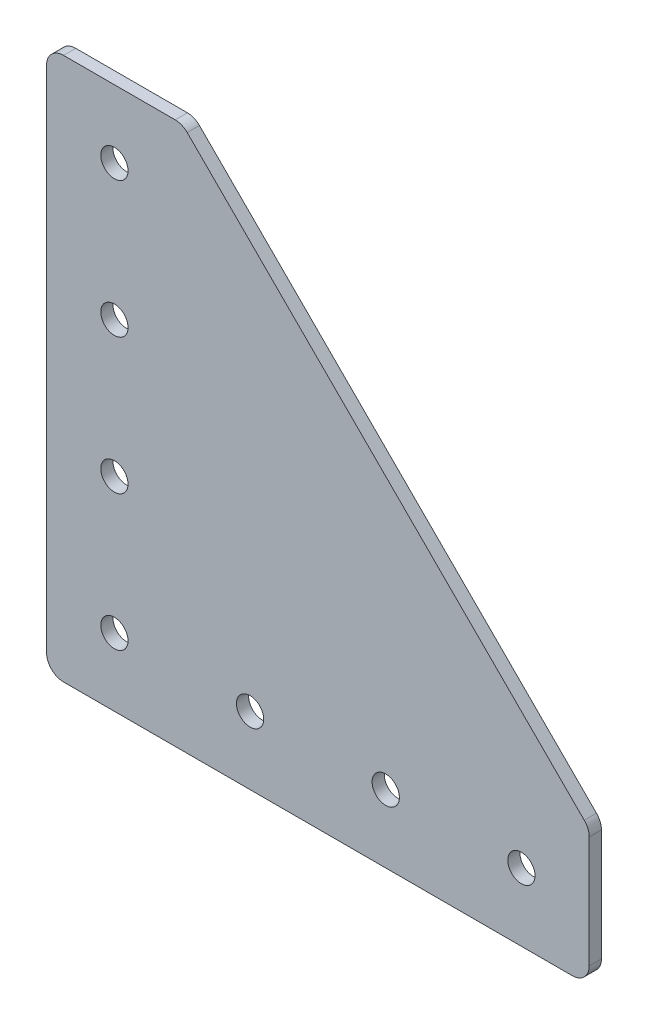
ISO-10303-21;
HEADER;
FILE_DESCRIPTION(('STEP AP214'),'2;1');
FILE_NAME('part.step','',(''),(''),'','','');
FILE_SCHEMA(('AUTOMOTIVE_DESIGN { 1 0 10303 214 1 1 1 1 }'));
ENDSEC;
DATA;
#1=APPLICATION_CONTEXT('core data for automotive mechanical design processes');
#2=APPLICATION_PROTOCOL_DEFINITION('international standard','automotive_design',2000,#1);
#3=PRODUCT_CONTEXT('',#1,'mechanical');
#4=PRODUCT('Part','Part','',(#3));
#5=PRODUCT_RELATED_PRODUCT_CATEGORY('part','',(#4));
#6=PRODUCT_DEFINITION_FORMATION('','',#4);
#7=PRODUCT_DEFINITION_CONTEXT('part definition',#1,'design');
#8=PRODUCT_DEFINITION('design','',#6,#7);
#9=PRODUCT_DEFINITION_SHAPE('','',#8);
#10=(LENGTH_UNIT() NAMED_UNIT(*) SI_UNIT(.MILLI.,.METRE.));
#11=(NAMED_UNIT(*) PLANE_ANGLE_UNIT() SI_UNIT($,.RADIAN.));
#12=(NAMED_UNIT(*) SI_UNIT($,.STERADIAN.) SOLID_ANGLE_UNIT());
#13=UNCERTAINTY_MEASURE_WITH_UNIT(LENGTH_MEASURE(1.E-05),#10,'distance_accuracy_value','');
#14=(GEOMETRIC_REPRESENTATION_CONTEXT(3) GLOBAL_UNCERTAINTY_ASSIGNED_CONTEXT((#13)) GLOBAL_UNIT_ASSIGNED_CONTEXT((#10,
#11,#12)) REPRESENTATION_CONTEXT('',''));
#15=CARTESIAN_POINT('',(0.,0.,0.));
#16=DIRECTION('',(0.,0.,1.));
#17=DIRECTION('',(1.,0.,0.));
#18=AXIS2_PLACEMENT_3D('',#15,#16,#17);
#19=CARTESIAN_POINT('',(0.,0.,1.143));
#20=DIRECTION('',(0.,0.,1.));
#21=DIRECTION('',(1.,0.,0.));
#22=AXIS2_PLACEMENT_3D('',#19,#20,#21);
#23=PLANE('',#22);
#24=CARTESIAN_POINT('',(4.94631578947392,-54.8105263157901,1.143));
#25=DIRECTION('',(0.,0.,1.));
#26=DIRECTION('',(1.,0.,0.));
#27=AXIS2_PLACEMENT_3D('',#24,#25,#26);
#28=CIRCLE('',#27,2.5527);
#29=CARTESIAN_POINT('',(7.49901578947392,-54.8105263157901,1.143));
#30=VERTEX_POINT('',#29);
#31=EDGE_CURVE('E233',#30,#30,#28,.T.);
#32=ORIENTED_EDGE('',*,*,#31,.F.);
#33=EDGE_LOOP('',(#32));
#34=FACE_BOUND('',#33,.T.);
#35=CARTESIAN_POINT('',(-45.8536842105261,-54.8105263157901,1.143));
#36=DIRECTION('',(0.,0.,1.));
#37=DIRECTION('',(1.,0.,0.));
#38=AXIS2_PLACEMENT_3D('',#35,#36,#37);
#39=CIRCLE('',#38,2.5527);
#40=CARTESIAN_POINT('',(-43.3009842105261,-54.8105263157901,1.143));
#41=VERTEX_POINT('',#40);
#42=EDGE_CURVE('E221',#41,#41,#39,.T.);
#43=ORIENTED_EDGE('',*,*,#42,.F.);
#44=EDGE_LOOP('',(#43));
#45=FACE_BOUND('',#44,.T.);
#46=CARTESIAN_POINT('',(-45.8536842105266,-4.01052631579008,1.143));
#47=DIRECTION('',(0.,0.,1.));
#48=DIRECTION('',(1.,0.,0.));
#49=AXIS2_PLACEMENT_3D('',#46,#47,#48);
#50=CIRCLE('',#49,2.5527);
#51=CARTESIAN_POINT('',(-43.3009842105266,-4.01052631579008,1.143));
#52=VERTEX_POINT('',#51);
#53=EDGE_CURVE('E210',#52,#52,#50,.T.);
#54=ORIENTED_EDGE('',*,*,#53,.F.);
#55=EDGE_LOOP('',(#54));
#56=FACE_BOUND('',#55,.T.);
#57=DIRECTION('',(-1.,0.,0.));
#58=VECTOR('',#57,1.);
#59=CARTESIAN_POINT('',(-58.5536842105269,34.0894736842099,1.143));
#60=LINE('',#59,#58);
#61=CARTESIAN_POINT('',(-34.4688122710615,34.0894736842099,1.143));
#62=VERTEX_POINT('',#61);
#63=CARTESIAN_POINT('',(-55.3786842105269,34.0894736842099,1.143));
#64=VERTEX_POINT('',#63);
#65=EDGE_CURVE('E149',#62,#64,#60,.T.);
#66=ORIENTED_EDGE('',*,*,#65,.T.);
#67=CARTESIAN_POINT('',(-55.3786842105269,30.9144736842099,1.143));
#68=DIRECTION('',(0.,0.,1.));
#69=DIRECTION('',(1.,0.,0.));
#70=AXIS2_PLACEMENT_3D('',#67,#68,#69);
#71=CIRCLE('',#70,3.175);
#72=CARTESIAN_POINT('',(-58.5536842105269,30.9144736842099,1.143));
#73=VERTEX_POINT('',#72);
#74=EDGE_CURVE('E174',#64,#73,#71,.T.);
#75=ORIENTED_EDGE('',*,*,#74,.T.);
#76=DIRECTION('',(0.,-1.,0.));
#77=VECTOR('',#76,1.);
#78=CARTESIAN_POINT('',(-58.5536842105269,34.0894736842099,1.143));
#79=LINE('',#78,#77);
#80=CARTESIAN_POINT('',(-58.5536842105269,-64.3355263157901,1.143));
#81=VERTEX_POINT('',#80);
#82=EDGE_CURVE('E131',#73,#81,#79,.T.);
#83=ORIENTED_EDGE('',*,*,#82,.T.);
#84=CARTESIAN_POINT('',(-55.3786842105269,-64.3355263157901,1.143));
#85=DIRECTION('',(0.,0.,1.));
#86=DIRECTION('',(1.,0.,0.));
#87=AXIS2_PLACEMENT_3D('',#84,#85,#86);
#88=CIRCLE('',#87,3.175);
#89=CARTESIAN_POINT('',(-55.3786842105269,-67.5105263157901,1.143));
#90=VERTEX_POINT('',#89);
#91=EDGE_CURVE('E169',#81,#90,#88,.T.);
#92=ORIENTED_EDGE('',*,*,#91,.T.);
#93=DIRECTION('',(1.,0.,0.));
#94=VECTOR('',#93,1.);
#95=CARTESIAN_POINT('',(-58.5536842105269,-67.5105263157901,1.143));
#96=LINE('',#95,#94);
#97=CARTESIAN_POINT('',(39.8713157894731,-67.5105263157901,1.143));
#98=VERTEX_POINT('',#97);
#99=EDGE_CURVE('E191',#90,#98,#96,.T.);
#100=ORIENTED_EDGE('',*,*,#99,.T.);
#101=CARTESIAN_POINT('',(39.8713157894731,-64.3355263157901,1.143));
#102=DIRECTION('',(0.,0.,1.));
#103=DIRECTION('',(1.,0.,0.));
#104=AXIS2_PLACEMENT_3D('',#101,#102,#103);
#105=CIRCLE('',#104,3.175);
#106=CARTESIAN_POINT('',(43.0463157894731,-64.3355263157901,1.143));
#107=VERTEX_POINT('',#106);
#108=EDGE_CURVE('E171',#98,#107,#105,.T.);
#109=ORIENTED_EDGE('',*,*,#108,.T.);
#110=DIRECTION('',(0.,1.,0.));
#111=VECTOR('',#110,1.);
#112=CARTESIAN_POINT('',(43.0463157894731,-67.5105263157901,1.143));
#113=LINE('',#112,#111);
#114=CARTESIAN_POINT('',(43.0463157894731,-43.4256543763247,1.143));
#115=VERTEX_POINT('',#114);
#116=EDGE_CURVE('E203',#107,#115,#113,.T.);
#117=ORIENTED_EDGE('',*,*,#116,.T.);
#118=CARTESIAN_POINT('',(39.8713157894731,-43.4256543763247,1.143));
#119=DIRECTION('',(0.,0.,1.));
#120=DIRECTION('',(1.,0.,0.));
#121=AXIS2_PLACEMENT_3D('',#118,#119,#120);
#122=CIRCLE('',#121,3.175);
#123=CARTESIAN_POINT('',(42.1163798197404,-41.1805903460574,1.143));
#124=VERTEX_POINT('',#123);
#125=EDGE_CURVE('E55',#115,#124,#122,.T.);
#126=ORIENTED_EDGE('',*,*,#125,.T.);
#127=DIRECTION('',(-0.707106781186548,0.707106781186547,0.));
#128=VECTOR('',#127,1.);
#129=CARTESIAN_POINT('',(43.0463157894731,-42.1105263157901,1.143));
#130=LINE('',#129,#128);
#131=CARTESIAN_POINT('',(-32.2237482407942,33.1595377144772,1.143));
#132=VERTEX_POINT('',#131);
#133=EDGE_CURVE('E204',#124,#132,#130,.T.);
#134=ORIENTED_EDGE('',*,*,#133,.T.);
#135=CARTESIAN_POINT('',(-34.4688122710615,30.9144736842099,1.143));
#136=DIRECTION('',(0.,0.,1.));
#137=DIRECTION('',(1.,0.,0.));
#138=AXIS2_PLACEMENT_3D('',#135,#136,#137);
#139=CIRCLE('',#138,3.175);
#140=EDGE_CURVE('E167',#132,#62,#139,.T.);
#141=ORIENTED_EDGE('',*,*,#140,.T.);
#142=EDGE_LOOP('',(#66,#75,#83,#92,#100,#109,#117,#126,#134,#141));
#143=FACE_BOUND('',#142,.T.);
#144=CARTESIAN_POINT('',(-45.8536842105269,21.3894736842099,1.143));
#145=DIRECTION('',(0.,0.,1.));
#146=DIRECTION('',(1.,0.,0.));
#147=AXIS2_PLACEMENT_3D('',#144,#145,#146);
#148=CIRCLE('',#147,2.5527);
#149=CARTESIAN_POINT('',(-43.3009842105269,21.3894736842099,1.143));
#150=VERTEX_POINT('',#149);
#151=EDGE_CURVE('E140',#150,#150,#148,.T.);
#152=ORIENTED_EDGE('',*,*,#151,.F.);
#153=EDGE_LOOP('',(#152));
#154=FACE_BOUND('',#153,.T.);
#155=CARTESIAN_POINT('',(-45.8536842105263,-29.4105263157901,1.143));
#156=DIRECTION('',(0.,0.,1.));
#157=DIRECTION('',(1.,0.,0.));
#158=AXIS2_PLACEMENT_3D('',#155,#156,#157);
#159=CIRCLE('',#158,2.5527);
#160=CARTESIAN_POINT('',(-43.3009842105263,-29.4105263157901,1.143));
#161=VERTEX_POINT('',#160);
#162=EDGE_CURVE('E215',#161,#161,#159,.T.);
#163=ORIENTED_EDGE('',*,*,#162,.F.);
#164=EDGE_LOOP('',(#163));
#165=FACE_BOUND('',#164,.T.);
#166=CARTESIAN_POINT('',(-20.4536842105261,-54.8105263157901,1.143));
#167=DIRECTION('',(0.,0.,1.));
#168=DIRECTION('',(1.,0.,0.));
#169=AXIS2_PLACEMENT_3D('',#166,#167,#168);
#170=CIRCLE('',#169,2.5527);
#171=CARTESIAN_POINT('',(-17.9009842105261,-54.8105263157901,1.143));
#172=VERTEX_POINT('',#171);
#173=EDGE_CURVE('E227',#172,#172,#170,.T.);
#174=ORIENTED_EDGE('',*,*,#173,.F.);
#175=EDGE_LOOP('',(#174));
#176=FACE_BOUND('',#175,.T.);
#177=CARTESIAN_POINT('',(30.3463157894739,-54.8105263157901,1.143));
#178=DIRECTION('',(0.,0.,1.));
#179=DIRECTION('',(1.,0.,0.));
#180=AXIS2_PLACEMENT_3D('',#177,#178,#179);
#181=CIRCLE('',#180,2.5527);
#182=CARTESIAN_POINT('',(32.8990157894739,-54.8105263157901,1.143));
#183=VERTEX_POINT('',#182);
#184=EDGE_CURVE('E239',#183,#183,#181,.T.);
#185=ORIENTED_EDGE('',*,*,#184,.F.);
#186=EDGE_LOOP('',(#185));
#187=FACE_BOUND('',#186,.T.);
#188=ADVANCED_FACE('F33',(#34,#45,#56,#143,#154,#165,#176,#187),#23,.T.);
#189=CARTESIAN_POINT('',(0.,0.,-1.143));
#190=DIRECTION('',(0.,0.,1.));
#191=DIRECTION('',(1.,0.,0.));
#192=AXIS2_PLACEMENT_3D('',#189,#190,#191);
#193=PLANE('',#192);
#194=CARTESIAN_POINT('',(4.94631578947392,-54.8105263157901,-1.143));
#195=DIRECTION('',(0.,0.,1.));
#196=DIRECTION('',(1.,0.,0.));
#197=AXIS2_PLACEMENT_3D('',#194,#195,#196);
#198=CIRCLE('',#197,2.5527);
#199=CARTESIAN_POINT('',(7.49901578947392,-54.8105263157901,-1.143));
#200=VERTEX_POINT('',#199);
#201=EDGE_CURVE('E236',#200,#200,#198,.T.);
#202=ORIENTED_EDGE('',*,*,#201,.T.);
#203=EDGE_LOOP('',(#202));
#204=FACE_BOUND('',#203,.T.);
#205=CARTESIAN_POINT('',(-45.8536842105261,-54.8105263157901,-1.143));
#206=DIRECTION('',(0.,0.,1.));
#207=DIRECTION('',(1.,0.,0.));
#208=AXIS2_PLACEMENT_3D('',#205,#206,#207);
#209=CIRCLE('',#208,2.5527);
#210=CARTESIAN_POINT('',(-43.3009842105261,-54.8105263157901,-1.143));
#211=VERTEX_POINT('',#210);
#212=EDGE_CURVE('E224',#211,#211,#209,.T.);
#213=ORIENTED_EDGE('',*,*,#212,.T.);
#214=EDGE_LOOP('',(#213));
#215=FACE_BOUND('',#214,.T.);
#216=CARTESIAN_POINT('',(-45.8536842105266,-4.01052631579008,-1.143));
#217=DIRECTION('',(0.,0.,1.));
#218=DIRECTION('',(1.,0.,0.));
#219=AXIS2_PLACEMENT_3D('',#216,#217,#218);
#220=CIRCLE('',#219,2.5527);
#221=CARTESIAN_POINT('',(-43.3009842105266,-4.01052631579008,-1.143));
#222=VERTEX_POINT('',#221);
#223=EDGE_CURVE('E212',#222,#222,#220,.T.);
#224=ORIENTED_EDGE('',*,*,#223,.T.);
#225=EDGE_LOOP('',(#224));
#226=FACE_BOUND('',#225,.T.);
#227=DIRECTION('',(0.,-1.,0.));
#228=VECTOR('',#227,1.);
#229=CARTESIAN_POINT('',(-58.5536842105269,34.0894736842099,-1.143));
#230=LINE('',#229,#228);
#231=CARTESIAN_POINT('',(-58.5536842105269,30.9144736842099,-1.143));
#232=VERTEX_POINT('',#231);
#233=CARTESIAN_POINT('',(-58.5536842105269,-64.3355263157901,-1.143));
#234=VERTEX_POINT('',#233);
#235=EDGE_CURVE('E128',#232,#234,#230,.T.);
#236=ORIENTED_EDGE('',*,*,#235,.F.);
#237=CARTESIAN_POINT('',(-55.3786842105269,30.9144736842099,-1.143));
#238=DIRECTION('',(0.,0.,1.));
#239=DIRECTION('',(1.,0.,0.));
#240=AXIS2_PLACEMENT_3D('',#237,#238,#239);
#241=CIRCLE('',#240,3.175);
#242=CARTESIAN_POINT('',(-55.3786842105269,34.0894736842099,-1.143));
#243=VERTEX_POINT('',#242);
#244=EDGE_CURVE('E111',#232,#243,#241,.F.);
#245=ORIENTED_EDGE('',*,*,#244,.T.);
#246=DIRECTION('',(-1.,0.,0.));
#247=VECTOR('',#246,1.);
#248=CARTESIAN_POINT('',(-58.5536842105269,34.0894736842099,-1.143));
#249=LINE('',#248,#247);
#250=CARTESIAN_POINT('',(-34.4688122710615,34.0894736842099,-1.143));
#251=VERTEX_POINT('',#250);
#252=EDGE_CURVE('E156',#251,#243,#249,.T.);
#253=ORIENTED_EDGE('',*,*,#252,.F.);
#254=CARTESIAN_POINT('',(-34.4688122710615,30.9144736842099,-1.143));
#255=DIRECTION('',(0.,0.,1.));
#256=DIRECTION('',(1.,0.,0.));
#257=AXIS2_PLACEMENT_3D('',#254,#255,#256);
#258=CIRCLE('',#257,3.175);
#259=CARTESIAN_POINT('',(-32.2237482407942,33.1595377144772,-1.143));
#260=VERTEX_POINT('',#259);
#261=EDGE_CURVE('E132',#251,#260,#258,.F.);
#262=ORIENTED_EDGE('',*,*,#261,.T.);
#263=DIRECTION('',(-0.707106781186548,0.707106781186547,0.));
#264=VECTOR('',#263,1.);
#265=CARTESIAN_POINT('',(43.0463157894731,-42.1105263157901,-1.143));
#266=LINE('',#265,#264);
#267=CARTESIAN_POINT('',(42.1163798197404,-41.1805903460574,-1.143));
#268=VERTEX_POINT('',#267);
#269=EDGE_CURVE('E154',#268,#260,#266,.T.);
#270=ORIENTED_EDGE('',*,*,#269,.F.);
#271=CARTESIAN_POINT('',(39.8713157894731,-43.4256543763247,-1.143));
#272=DIRECTION('',(0.,0.,1.));
#273=DIRECTION('',(1.,0.,0.));
#274=AXIS2_PLACEMENT_3D('',#271,#272,#273);
#275=CIRCLE('',#274,3.175);
#276=CARTESIAN_POINT('',(43.0463157894731,-43.4256543763247,-1.143));
#277=VERTEX_POINT('',#276);
#278=EDGE_CURVE('E122',#268,#277,#275,.F.);
#279=ORIENTED_EDGE('',*,*,#278,.T.);
#280=DIRECTION('',(0.,1.,0.));
#281=VECTOR('',#280,1.);
#282=CARTESIAN_POINT('',(43.0463157894731,-67.5105263157901,-1.143));
#283=LINE('',#282,#281);
#284=CARTESIAN_POINT('',(43.0463157894731,-64.3355263157901,-1.143));
#285=VERTEX_POINT('',#284);
#286=EDGE_CURVE('E143',#285,#277,#283,.T.);
#287=ORIENTED_EDGE('',*,*,#286,.F.);
#288=CARTESIAN_POINT('',(39.8713157894731,-64.3355263157901,-1.143));
#289=DIRECTION('',(0.,0.,1.));
#290=DIRECTION('',(1.,0.,0.));
#291=AXIS2_PLACEMENT_3D('',#288,#289,#290);
#292=CIRCLE('',#291,3.175);
#293=CARTESIAN_POINT('',(39.8713157894731,-67.5105263157901,-1.143));
#294=VERTEX_POINT('',#293);
#295=EDGE_CURVE('E161',#285,#294,#292,.F.);
#296=ORIENTED_EDGE('',*,*,#295,.T.);
#297=DIRECTION('',(1.,0.,0.));
#298=VECTOR('',#297,1.);
#299=CARTESIAN_POINT('',(-58.5536842105269,-67.5105263157901,-1.143));
#300=LINE('',#299,#298);
#301=CARTESIAN_POINT('',(-55.3786842105269,-67.5105263157901,-1.143));
#302=VERTEX_POINT('',#301);
#303=EDGE_CURVE('E139',#302,#294,#300,.T.);
#304=ORIENTED_EDGE('',*,*,#303,.F.);
#305=CARTESIAN_POINT('',(-55.3786842105269,-64.3355263157901,-1.143));
#306=DIRECTION('',(0.,0.,1.));
#307=DIRECTION('',(1.,0.,0.));
#308=AXIS2_PLACEMENT_3D('',#305,#306,#307);
#309=CIRCLE('',#308,3.175);
#310=EDGE_CURVE('E138',#302,#234,#309,.F.);
#311=ORIENTED_EDGE('',*,*,#310,.T.);
#312=EDGE_LOOP('',(#236,#245,#253,#262,#270,#279,#287,#296,#304,#311));
#313=FACE_BOUND('',#312,.T.);
#314=CARTESIAN_POINT('',(-45.8536842105269,21.3894736842099,-1.143));
#315=DIRECTION('',(0.,0.,1.));
#316=DIRECTION('',(1.,0.,0.));
#317=AXIS2_PLACEMENT_3D('',#314,#315,#316);
#318=CIRCLE('',#317,2.5527);
#319=CARTESIAN_POINT('',(-43.3009842105269,21.3894736842099,-1.143));
#320=VERTEX_POINT('',#319);
#321=EDGE_CURVE('E146',#320,#320,#318,.T.);
#322=ORIENTED_EDGE('',*,*,#321,.T.);
#323=EDGE_LOOP('',(#322));
#324=FACE_BOUND('',#323,.T.);
#325=CARTESIAN_POINT('',(-45.8536842105263,-29.4105263157901,-1.143));
#326=DIRECTION('',(0.,0.,1.));
#327=DIRECTION('',(1.,0.,0.));
#328=AXIS2_PLACEMENT_3D('',#325,#326,#327);
#329=CIRCLE('',#328,2.5527);
#330=CARTESIAN_POINT('',(-43.3009842105263,-29.4105263157901,-1.143));
#331=VERTEX_POINT('',#330);
#332=EDGE_CURVE('E218',#331,#331,#329,.T.);
#333=ORIENTED_EDGE('',*,*,#332,.T.);
#334=EDGE_LOOP('',(#333));
#335=FACE_BOUND('',#334,.T.);
#336=CARTESIAN_POINT('',(-20.4536842105261,-54.8105263157901,-1.143));
#337=DIRECTION('',(0.,0.,1.));
#338=DIRECTION('',(1.,0.,0.));
#339=AXIS2_PLACEMENT_3D('',#336,#337,#338);
#340=CIRCLE('',#339,2.5527);
#341=CARTESIAN_POINT('',(-17.9009842105261,-54.8105263157901,-1.143));
#342=VERTEX_POINT('',#341);
#343=EDGE_CURVE('E230',#342,#342,#340,.T.);
#344=ORIENTED_EDGE('',*,*,#343,.T.);
#345=EDGE_LOOP('',(#344));
#346=FACE_BOUND('',#345,.T.);
#347=CARTESIAN_POINT('',(30.3463157894739,-54.8105263157901,-1.143));
#348=DIRECTION('',(0.,0.,1.));
#349=DIRECTION('',(1.,0.,0.));
#350=AXIS2_PLACEMENT_3D('',#347,#348,#349);
#351=CIRCLE('',#350,2.5527);
#352=CARTESIAN_POINT('',(32.8990157894739,-54.8105263157901,-1.143));
#353=VERTEX_POINT('',#352);
#354=EDGE_CURVE('E242',#353,#353,#351,.T.);
#355=ORIENTED_EDGE('',*,*,#354,.T.);
#356=EDGE_LOOP('',(#355));
#357=FACE_BOUND('',#356,.T.);
#358=ADVANCED_FACE('F135',(#204,#215,#226,#313,#324,#335,#346,#357),#193,.F.);
#359=CARTESIAN_POINT('',(-58.5536842105269,34.0894736842099,1.143));
#360=DIRECTION('',(1.,0.,0.));
#361=DIRECTION('',(0.,1.,0.));
#362=AXIS2_PLACEMENT_3D('',#359,#360,#361);
#363=PLANE('',#362);
#364=ORIENTED_EDGE('',*,*,#82,.F.);
#365=DIRECTION('',(0.,0.,-1.));
#366=VECTOR('',#365,1.);
#367=CARTESIAN_POINT('',(-58.5536842105269,30.9144736842099,1.143));
#368=LINE('',#367,#366);
#369=EDGE_CURVE('E115',#73,#232,#368,.T.);
#370=ORIENTED_EDGE('',*,*,#369,.T.);
#371=ORIENTED_EDGE('',*,*,#235,.T.);
#372=DIRECTION('',(0.,0.,-1.));
#373=VECTOR('',#372,1.);
#374=CARTESIAN_POINT('',(-58.5536842105269,-64.3355263157901,1.143));
#375=LINE('',#374,#373);
#376=EDGE_CURVE('E133',#234,#81,#375,.F.);
#377=ORIENTED_EDGE('',*,*,#376,.T.);
#378=EDGE_LOOP('',(#364,#370,#371,#377));
#379=FACE_BOUND('',#378,.T.);
#380=ADVANCED_FACE('F127',(#379),#363,.F.);
#381=CARTESIAN_POINT('',(-58.5536842105269,-67.5105263157901,1.143));
#382=DIRECTION('',(0.,1.,0.));
#383=DIRECTION('',(0.,0.,1.));
#384=AXIS2_PLACEMENT_3D('',#381,#382,#383);
#385=PLANE('',#384);
#386=ORIENTED_EDGE('',*,*,#303,.T.);
#387=DIRECTION('',(0.,0.,-1.));
#388=VECTOR('',#387,1.);
#389=CARTESIAN_POINT('',(39.8713157894731,-67.5105263157901,1.143));
#390=LINE('',#389,#388);
#391=EDGE_CURVE('E11',#294,#98,#390,.F.);
#392=ORIENTED_EDGE('',*,*,#391,.T.);
#393=ORIENTED_EDGE('',*,*,#99,.F.);
#394=DIRECTION('',(0.,0.,-1.));
#395=VECTOR('',#394,1.);
#396=CARTESIAN_POINT('',(-55.3786842105269,-67.5105263157901,1.143));
#397=LINE('',#396,#395);
#398=EDGE_CURVE('E41',#90,#302,#397,.T.);
#399=ORIENTED_EDGE('',*,*,#398,.T.);
#400=EDGE_LOOP('',(#386,#392,#393,#399));
#401=FACE_BOUND('',#400,.T.);
#402=ADVANCED_FACE('F188',(#401),#385,.F.);
#403=CARTESIAN_POINT('',(43.0463157894731,-67.5105263157901,1.143));
#404=DIRECTION('',(-1.,0.,0.));
#405=DIRECTION('',(0.,-1.,0.));
#406=AXIS2_PLACEMENT_3D('',#403,#404,#405);
#407=PLANE('',#406);
#408=ORIENTED_EDGE('',*,*,#286,.T.);
#409=DIRECTION('',(0.,0.,-1.));
#410=VECTOR('',#409,1.);
#411=CARTESIAN_POINT('',(43.0463157894731,-43.4256543763247,1.143));
#412=LINE('',#411,#410);
#413=EDGE_CURVE('E183',#277,#115,#412,.F.);
#414=ORIENTED_EDGE('',*,*,#413,.T.);
#415=ORIENTED_EDGE('',*,*,#116,.F.);
#416=DIRECTION('',(0.,0.,-1.));
#417=VECTOR('',#416,1.);
#418=CARTESIAN_POINT('',(43.0463157894731,-64.3355263157901,1.143));
#419=LINE('',#418,#417);
#420=EDGE_CURVE('E180',#107,#285,#419,.T.);
#421=ORIENTED_EDGE('',*,*,#420,.T.);
#422=EDGE_LOOP('',(#408,#414,#415,#421));
#423=FACE_BOUND('',#422,.T.);
#424=ADVANCED_FACE('F201',(#423),#407,.F.);
#425=CARTESIAN_POINT('',(43.0463157894731,-42.1105263157901,1.143));
#426=DIRECTION('',(-0.707106781186547,-0.707106781186548,0.));
#427=DIRECTION('',(0.707106781186548,-0.707106781186547,0.));
#428=AXIS2_PLACEMENT_3D('',#425,#426,#427);
#429=PLANE('',#428);
#430=ORIENTED_EDGE('',*,*,#133,.F.);
#431=DIRECTION('',(0.,0.,-1.));
#432=VECTOR('',#431,1.);
#433=CARTESIAN_POINT('',(42.1163798197404,-41.1805903460574,1.143));
#434=LINE('',#433,#432);
#435=EDGE_CURVE('E177',#124,#268,#434,.T.);
#436=ORIENTED_EDGE('',*,*,#435,.T.);
#437=ORIENTED_EDGE('',*,*,#269,.T.);
#438=DIRECTION('',(0.,0.,-1.));
#439=VECTOR('',#438,1.);
#440=CARTESIAN_POINT('',(-32.2237482407942,33.1595377144772,1.143));
#441=LINE('',#440,#439);
#442=EDGE_CURVE('E48',#260,#132,#441,.F.);
#443=ORIENTED_EDGE('',*,*,#442,.T.);
#444=EDGE_LOOP('',(#430,#436,#437,#443));
#445=FACE_BOUND('',#444,.T.);
#446=ADVANCED_FACE('F268',(#445),#429,.F.);
#447=CARTESIAN_POINT('',(-58.5536842105269,34.0894736842099,1.143));
#448=DIRECTION('',(0.,-1.,0.));
#449=DIRECTION('',(0.,0.,-1.));
#450=AXIS2_PLACEMENT_3D('',#447,#448,#449);
#451=PLANE('',#450);
#452=ORIENTED_EDGE('',*,*,#252,.T.);
#453=DIRECTION('',(0.,0.,-1.));
#454=VECTOR('',#453,1.);
#455=CARTESIAN_POINT('',(-55.3786842105269,34.0894736842099,1.143));
#456=LINE('',#455,#454);
#457=EDGE_CURVE('E116',#243,#64,#456,.F.);
#458=ORIENTED_EDGE('',*,*,#457,.T.);
#459=ORIENTED_EDGE('',*,*,#65,.F.);
#460=DIRECTION('',(0.,0.,-1.));
#461=VECTOR('',#460,1.);
#462=CARTESIAN_POINT('',(-34.4688122710615,34.0894736842099,1.143));
#463=LINE('',#462,#461);
#464=EDGE_CURVE('E121',#62,#251,#463,.T.);
#465=ORIENTED_EDGE('',*,*,#464,.T.);
#466=EDGE_LOOP('',(#452,#458,#459,#465));
#467=FACE_BOUND('',#466,.T.);
#468=ADVANCED_FACE('F265',(#467),#451,.F.);
#469=CARTESIAN_POINT('',(-45.8536842105269,21.3894736842099,1.143));
#470=DIRECTION('',(0.,0.,-1.));
#471=DIRECTION('',(-1.,0.,0.));
#472=AXIS2_PLACEMENT_3D('',#469,#470,#471);
#473=CYLINDRICAL_SURFACE('',#472,2.5527);
#474=ORIENTED_EDGE('',*,*,#151,.T.);
#475=EDGE_LOOP('',(#474));
#476=FACE_BOUND('',#475,.T.);
#477=ORIENTED_EDGE('',*,*,#321,.F.);
#478=EDGE_LOOP('',(#477));
#479=FACE_BOUND('',#478,.T.);
#480=ADVANCED_FACE('F262',(#476,#479),#473,.F.);
#481=CARTESIAN_POINT('',(-45.8536842105266,-4.01052631579008,1.143));
#482=DIRECTION('',(0.,0.,-1.));
#483=DIRECTION('',(-1.,0.,0.));
#484=AXIS2_PLACEMENT_3D('',#481,#482,#483);
#485=CYLINDRICAL_SURFACE('',#484,2.5527);
#486=ORIENTED_EDGE('',*,*,#53,.T.);
#487=EDGE_LOOP('',(#486));
#488=FACE_BOUND('',#487,.T.);
#489=ORIENTED_EDGE('',*,*,#223,.F.);
#490=EDGE_LOOP('',(#489));
#491=FACE_BOUND('',#490,.T.);
#492=ADVANCED_FACE('F327',(#488,#491),#485,.F.);
#493=CARTESIAN_POINT('',(-45.8536842105263,-29.4105263157901,1.143));
#494=DIRECTION('',(0.,0.,-1.));
#495=DIRECTION('',(-1.,0.,0.));
#496=AXIS2_PLACEMENT_3D('',#493,#494,#495);
#497=CYLINDRICAL_SURFACE('',#496,2.5527);
#498=ORIENTED_EDGE('',*,*,#162,.T.);
#499=EDGE_LOOP('',(#498));
#500=FACE_BOUND('',#499,.T.);
#501=ORIENTED_EDGE('',*,*,#332,.F.);
#502=EDGE_LOOP('',(#501));
#503=FACE_BOUND('',#502,.T.);
#504=ADVANCED_FACE('F324',(#500,#503),#497,.F.);
#505=CARTESIAN_POINT('',(-45.8536842105261,-54.8105263157901,1.143));
#506=DIRECTION('',(0.,0.,-1.));
#507=DIRECTION('',(-1.,0.,0.));
#508=AXIS2_PLACEMENT_3D('',#505,#506,#507);
#509=CYLINDRICAL_SURFACE('',#508,2.5527);
#510=ORIENTED_EDGE('',*,*,#42,.T.);
#511=EDGE_LOOP('',(#510));
#512=FACE_BOUND('',#511,.T.);
#513=ORIENTED_EDGE('',*,*,#212,.F.);
#514=EDGE_LOOP('',(#513));
#515=FACE_BOUND('',#514,.T.);
#516=ADVANCED_FACE('F308',(#512,#515),#509,.F.);
#517=CARTESIAN_POINT('',(-20.4536842105261,-54.8105263157901,1.143));
#518=DIRECTION('',(0.,0.,-1.));
#519=DIRECTION('',(-1.,0.,0.));
#520=AXIS2_PLACEMENT_3D('',#517,#518,#519);
#521=CYLINDRICAL_SURFACE('',#520,2.5527);
#522=ORIENTED_EDGE('',*,*,#173,.T.);
#523=EDGE_LOOP('',(#522));
#524=FACE_BOUND('',#523,.T.);
#525=ORIENTED_EDGE('',*,*,#343,.F.);
#526=EDGE_LOOP('',(#525));
#527=FACE_BOUND('',#526,.T.);
#528=ADVANCED_FACE('F304',(#524,#527),#521,.F.);
#529=CARTESIAN_POINT('',(4.94631578947392,-54.8105263157901,1.143));
#530=DIRECTION('',(0.,0.,-1.));
#531=DIRECTION('',(-1.,0.,0.));
#532=AXIS2_PLACEMENT_3D('',#529,#530,#531);
#533=CYLINDRICAL_SURFACE('',#532,2.5527);
#534=ORIENTED_EDGE('',*,*,#31,.T.);
#535=EDGE_LOOP('',(#534));
#536=FACE_BOUND('',#535,.T.);
#537=ORIENTED_EDGE('',*,*,#201,.F.);
#538=EDGE_LOOP('',(#537));
#539=FACE_BOUND('',#538,.T.);
#540=ADVANCED_FACE('F307',(#536,#539),#533,.F.);
#541=CARTESIAN_POINT('',(30.3463157894739,-54.8105263157901,1.143));
#542=DIRECTION('',(0.,0.,-1.));
#543=DIRECTION('',(-1.,0.,0.));
#544=AXIS2_PLACEMENT_3D('',#541,#542,#543);
#545=CYLINDRICAL_SURFACE('',#544,2.5527);
#546=ORIENTED_EDGE('',*,*,#184,.T.);
#547=EDGE_LOOP('',(#546));
#548=FACE_BOUND('',#547,.T.);
#549=ORIENTED_EDGE('',*,*,#354,.F.);
#550=EDGE_LOOP('',(#549));
#551=FACE_BOUND('',#550,.T.);
#552=ADVANCED_FACE('F248',(#548,#551),#545,.F.);
#553=CARTESIAN_POINT('',(-55.3786842105269,30.9144736842099,1.143));
#554=DIRECTION('',(0.,0.,-1.));
#555=DIRECTION('',(-1.,0.,0.));
#556=AXIS2_PLACEMENT_3D('',#553,#554,#555);
#557=CYLINDRICAL_SURFACE('',#556,3.175);
#558=ORIENTED_EDGE('',*,*,#74,.F.);
#559=ORIENTED_EDGE('',*,*,#457,.F.);
#560=ORIENTED_EDGE('',*,*,#244,.F.);
#561=ORIENTED_EDGE('',*,*,#369,.F.);
#562=EDGE_LOOP('',(#558,#559,#560,#561));
#563=FACE_BOUND('',#562,.T.);
#564=ADVANCED_FACE('F114',(#563),#557,.T.);
#565=CARTESIAN_POINT('',(39.8713157894731,-43.4256543763247,1.143));
#566=DIRECTION('',(0.,0.,-1.));
#567=DIRECTION('',(-1.,0.,0.));
#568=AXIS2_PLACEMENT_3D('',#565,#566,#567);
#569=CYLINDRICAL_SURFACE('',#568,3.175);
#570=ORIENTED_EDGE('',*,*,#125,.F.);
#571=ORIENTED_EDGE('',*,*,#413,.F.);
#572=ORIENTED_EDGE('',*,*,#278,.F.);
#573=ORIENTED_EDGE('',*,*,#435,.F.);
#574=EDGE_LOOP('',(#570,#571,#572,#573));
#575=FACE_BOUND('',#574,.T.);
#576=ADVANCED_FACE('F280',(#575),#569,.T.);
#577=CARTESIAN_POINT('',(39.8713157894731,-64.3355263157901,1.143));
#578=DIRECTION('',(0.,0.,-1.));
#579=DIRECTION('',(-1.,0.,0.));
#580=AXIS2_PLACEMENT_3D('',#577,#578,#579);
#581=CYLINDRICAL_SURFACE('',#580,3.175);
#582=ORIENTED_EDGE('',*,*,#108,.F.);
#583=ORIENTED_EDGE('',*,*,#391,.F.);
#584=ORIENTED_EDGE('',*,*,#295,.F.);
#585=ORIENTED_EDGE('',*,*,#420,.F.);
#586=EDGE_LOOP('',(#582,#583,#584,#585));
#587=FACE_BOUND('',#586,.T.);
#588=ADVANCED_FACE('F198',(#587),#581,.T.);
#589=CARTESIAN_POINT('',(-55.3786842105269,-64.3355263157901,1.143));
#590=DIRECTION('',(0.,0.,-1.));
#591=DIRECTION('',(-1.,0.,0.));
#592=AXIS2_PLACEMENT_3D('',#589,#590,#591);
#593=CYLINDRICAL_SURFACE('',#592,3.175);
#594=ORIENTED_EDGE('',*,*,#91,.F.);
#595=ORIENTED_EDGE('',*,*,#376,.F.);
#596=ORIENTED_EDGE('',*,*,#310,.F.);
#597=ORIENTED_EDGE('',*,*,#398,.F.);
#598=EDGE_LOOP('',(#594,#595,#596,#597));
#599=FACE_BOUND('',#598,.T.);
#600=ADVANCED_FACE('F285',(#599),#593,.T.);
#601=CARTESIAN_POINT('',(-34.4688122710615,30.9144736842099,1.143));
#602=DIRECTION('',(0.,0.,-1.));
#603=DIRECTION('',(-1.,0.,0.));
#604=AXIS2_PLACEMENT_3D('',#601,#602,#603);
#605=CYLINDRICAL_SURFACE('',#604,3.175);
#606=ORIENTED_EDGE('',*,*,#140,.F.);
#607=ORIENTED_EDGE('',*,*,#442,.F.);
#608=ORIENTED_EDGE('',*,*,#261,.F.);
#609=ORIENTED_EDGE('',*,*,#464,.F.);
#610=EDGE_LOOP('',(#606,#607,#608,#609));
#611=FACE_BOUND('',#610,.T.);
#612=ADVANCED_FACE('F35',(#611),#605,.T.);
#613=CLOSED_SHELL('',(#188,#358,#380,#402,#424,#446,#468,#480,#492,#504,#516,#528,#540,#552,
#564,#576,#588,#600,#612));
#614=MANIFOLD_SOLID_BREP('B2',#613);
#615=ADVANCED_BREP_SHAPE_REPRESENTATION('',(#18,#614),#14);
#616=SHAPE_DEFINITION_REPRESENTATION(#9,#615);
ENDSEC;
END-ISO-10303-21;
